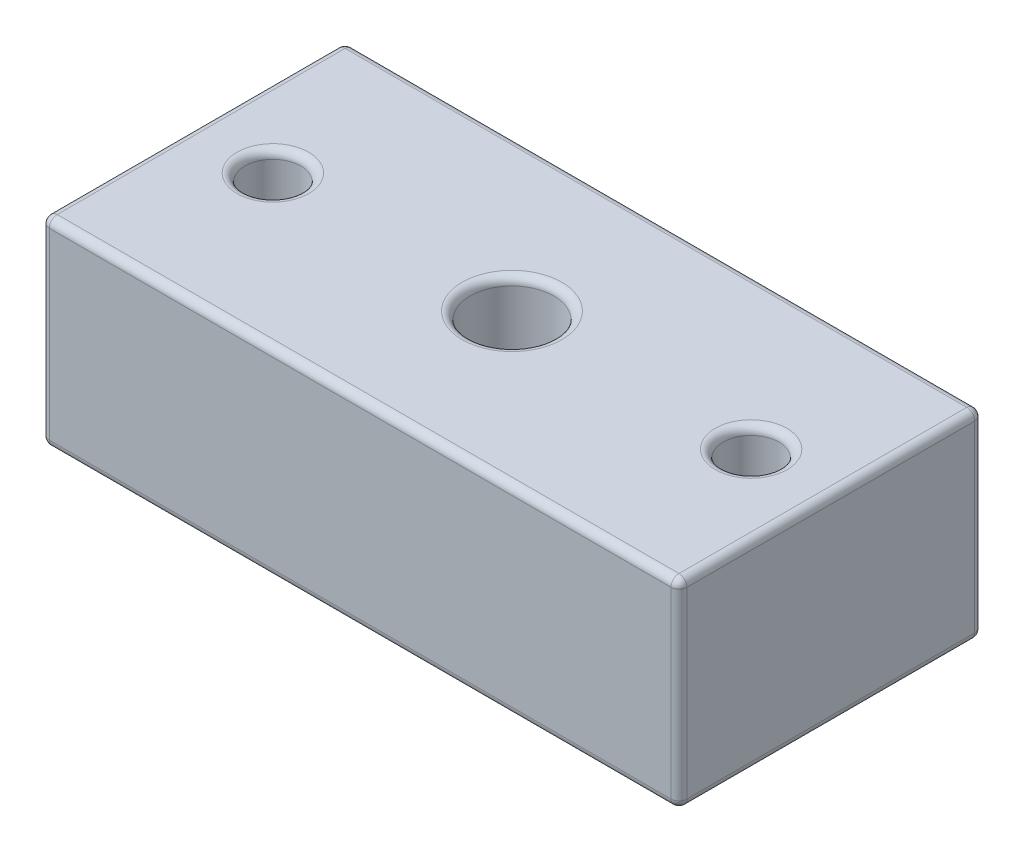
ISO-10303-21;
HEADER;
FILE_DESCRIPTION(('STEP AP214'),'2;1');
FILE_NAME('part.step','',(''),(''),'','','');
FILE_SCHEMA(('AUTOMOTIVE_DESIGN { 1 0 10303 214 1 1 1 1 }'));
ENDSEC;
DATA;
#1=APPLICATION_CONTEXT('core data for automotive mechanical design processes');
#2=APPLICATION_PROTOCOL_DEFINITION('international standard','automotive_design',2000,#1);
#3=PRODUCT_CONTEXT('',#1,'mechanical');
#4=PRODUCT('Part','Part','',(#3));
#5=PRODUCT_RELATED_PRODUCT_CATEGORY('part','',(#4));
#6=PRODUCT_DEFINITION_FORMATION('','',#4);
#7=PRODUCT_DEFINITION_CONTEXT('part definition',#1,'design');
#8=PRODUCT_DEFINITION('design','',#6,#7);
#9=PRODUCT_DEFINITION_SHAPE('','',#8);
#10=(LENGTH_UNIT() NAMED_UNIT(*) SI_UNIT(.MILLI.,.METRE.));
#11=(NAMED_UNIT(*) PLANE_ANGLE_UNIT() SI_UNIT($,.RADIAN.));
#12=(NAMED_UNIT(*) SI_UNIT($,.STERADIAN.) SOLID_ANGLE_UNIT());
#13=UNCERTAINTY_MEASURE_WITH_UNIT(LENGTH_MEASURE(1.E-05),#10,'distance_accuracy_value','');
#14=(GEOMETRIC_REPRESENTATION_CONTEXT(3) GLOBAL_UNCERTAINTY_ASSIGNED_CONTEXT((#13)) GLOBAL_UNIT_ASSIGNED_CONTEXT((#10,
#11,#12)) REPRESENTATION_CONTEXT('',''));
#15=CARTESIAN_POINT('',(0.,0.,0.));
#16=DIRECTION('',(0.,0.,1.));
#17=DIRECTION('',(1.,0.,0.));
#18=AXIS2_PLACEMENT_3D('',#15,#16,#17);
#19=CARTESIAN_POINT('',(0.,20.,0.));
#20=DIRECTION('',(0.,0.,-1.));
#21=DIRECTION('',(-1.,0.,0.));
#22=AXIS2_PLACEMENT_3D('',#19,#20,#21);
#23=PLANE('',#22);
#24=DIRECTION('',(1.,0.,0.));
#25=VECTOR('',#24,1.);
#26=CARTESIAN_POINT('',(0.,-4.,0.));
#27=LINE('',#26,#25);
#28=CARTESIAN_POINT('',(79.,-4.,0.));
#29=VERTEX_POINT('',#28);
#30=CARTESIAN_POINT('',(1.,-4.,0.));
#31=VERTEX_POINT('',#30);
#32=EDGE_CURVE('E268',#29,#31,#27,.F.);
#33=ORIENTED_EDGE('',*,*,#32,.T.);
#34=DIRECTION('',(0.,-1.,0.));
#35=VECTOR('',#34,1.);
#36=CARTESIAN_POINT('',(1.,20.,0.));
#37=LINE('',#36,#35);
#38=CARTESIAN_POINT('',(1.,19.,0.));
#39=VERTEX_POINT('',#38);
#40=EDGE_CURVE('E270',#31,#39,#37,.F.);
#41=ORIENTED_EDGE('',*,*,#40,.T.);
#42=DIRECTION('',(1.,0.,0.));
#43=VECTOR('',#42,1.);
#44=CARTESIAN_POINT('',(0.,19.,0.));
#45=LINE('',#44,#43);
#46=CARTESIAN_POINT('',(79.,19.,0.));
#47=VERTEX_POINT('',#46);
#48=EDGE_CURVE('E264',#39,#47,#45,.T.);
#49=ORIENTED_EDGE('',*,*,#48,.T.);
#50=DIRECTION('',(0.,-1.,0.));
#51=VECTOR('',#50,1.);
#52=CARTESIAN_POINT('',(79.,20.,0.));
#53=LINE('',#52,#51);
#54=EDGE_CURVE('E266',#47,#29,#53,.T.);
#55=ORIENTED_EDGE('',*,*,#54,.T.);
#56=EDGE_LOOP('',(#33,#41,#49,#55));
#57=FACE_BOUND('',#56,.T.);
#58=DIRECTION('',(0.,1.,0.));
#59=VECTOR('',#58,1.);
#60=CARTESIAN_POINT('',(36.4999999999999,0.,0.));
#61=LINE('',#60,#59);
#62=CARTESIAN_POINT('',(36.4999999999999,2.,0.));
#63=VERTEX_POINT('',#62);
#64=CARTESIAN_POINT('',(36.4999999999999,5.5,0.));
#65=VERTEX_POINT('',#64);
#66=EDGE_CURVE('E67',#63,#65,#61,.T.);
#67=ORIENTED_EDGE('',*,*,#66,.F.);
#68=CARTESIAN_POINT('',(39.9999999999999,2.,0.));
#69=DIRECTION('',(0.,0.,1.));
#70=DIRECTION('',(1.,0.,0.));
#71=AXIS2_PLACEMENT_3D('',#68,#69,#70);
#72=CIRCLE('',#71,3.5);
#73=CARTESIAN_POINT('',(43.4999999999999,2.,0.));
#74=VERTEX_POINT('',#73);
#75=EDGE_CURVE('E167',#63,#74,#72,.T.);
#76=ORIENTED_EDGE('',*,*,#75,.T.);
#77=DIRECTION('',(0.,1.,0.));
#78=VECTOR('',#77,1.);
#79=CARTESIAN_POINT('',(43.4999999999999,0.,0.));
#80=LINE('',#79,#78);
#81=CARTESIAN_POINT('',(43.4999999999999,5.5,0.));
#82=VERTEX_POINT('',#81);
#83=EDGE_CURVE('E173',#74,#82,#80,.T.);
#84=ORIENTED_EDGE('',*,*,#83,.T.);
#85=CARTESIAN_POINT('',(39.9999999999999,5.5,0.));
#86=DIRECTION('',(0.,0.,1.));
#87=DIRECTION('',(1.,0.,0.));
#88=AXIS2_PLACEMENT_3D('',#85,#86,#87);
#89=CIRCLE('',#88,3.5);
#90=EDGE_CURVE('E176',#82,#65,#89,.T.);
#91=ORIENTED_EDGE('',*,*,#90,.T.);
#92=EDGE_LOOP('',(#67,#76,#84,#91));
#93=FACE_BOUND('',#92,.T.);
#94=ADVANCED_FACE('F42',(#57,#93),#23,.T.);
#95=CARTESIAN_POINT('',(40.,20.,19.05));
#96=DIRECTION('',(0.,-1.,0.));
#97=DIRECTION('',(0.,0.,-1.));
#98=AXIS2_PLACEMENT_3D('',#95,#96,#97);
#99=CYLINDRICAL_SURFACE('',#98,10.5);
#100=DIRECTION('',(0.,-1.,0.));
#101=VECTOR('',#100,1.);
#102=CARTESIAN_POINT('',(36.4999999999999,20.,9.15050506338836));
#103=LINE('',#102,#101);
#104=CARTESIAN_POINT('',(36.4999999999999,5.5,9.15050506338836));
#105=VERTEX_POINT('',#104);
#106=CARTESIAN_POINT('',(36.4999999999999,2.,9.15050506338836));
#107=VERTEX_POINT('',#106);
#108=EDGE_CURVE('E160',#105,#107,#103,.T.);
#109=ORIENTED_EDGE('',*,*,#108,.F.);
#110=CARTESIAN_POINT('',(36.4999999999999,5.5,9.15050506338836));
#111=CARTESIAN_POINT('',(36.4999874124542,5.59548990894847,9.15052029417582));
#112=CARTESIAN_POINT('',(36.5039075788977,5.69097130454556,9.14912378533606));
#113=CARTESIAN_POINT('',(36.5195153590734,5.88119345368895,9.14362066230592));
#114=CARTESIAN_POINT('',(36.5312008760391,5.97593440018324,9.13951477969103));
#115=CARTESIAN_POINT('',(36.5621955680808,6.16372668369639,9.12872212646493));
#116=CARTESIAN_POINT('',(36.581482131316,6.2567821835713,9.12204301209836));
#117=CARTESIAN_POINT('',(36.6274814655783,6.44081157601583,9.106323321316));
#118=CARTESIAN_POINT('',(36.6541945049956,6.53178539322553,9.09728265955543));
#119=CARTESIAN_POINT('',(36.7451182817129,6.80054621160108,9.06702082888518));
#120=CARTESIAN_POINT('',(36.8201601646548,6.97445082046148,9.04264258562288));
#121=CARTESIAN_POINT('',(36.996751022514,7.30722753604522,8.98824152277516));
#122=CARTESIAN_POINT('',(37.0983162742467,7.46609033007884,8.95821524028655));
#123=CARTESIAN_POINT('',(37.329318058138,7.77051006487299,8.89459344654566));
#124=CARTESIAN_POINT('',(37.4596120151437,7.91539919992824,8.86090934800078));
#125=CARTESIAN_POINT('',(37.7425410033573,8.1817239444744,8.79451522584178));
#126=CARTESIAN_POINT('',(37.8951800043006,8.30315537764939,8.7618053765543));
#127=CARTESIAN_POINT('',(38.2233870849901,8.52217751416979,8.70001411462704));
#128=CARTESIAN_POINT('',(38.3994496456615,8.61906323160353,8.67104969044832));
#129=CARTESIAN_POINT('',(38.7664976666904,8.78157309464441,8.62106369372534));
#130=CARTESIAN_POINT('',(38.9574785476129,8.84720679004201,8.60003969520388));
#131=CARTESIAN_POINT('',(39.3418972790609,8.94307498951626,8.56893251099217));
#132=CARTESIAN_POINT('',(39.5350185718738,8.97446144945536,8.55849418454639));
#133=CARTESIAN_POINT('',(39.9240536144191,9.00460704932108,8.54847370671976));
#134=CARTESIAN_POINT('',(40.1199666876509,9.00337396358892,8.54888896856138));
#135=CARTESIAN_POINT('',(40.5008634409032,8.96904504165395,8.5602886435316));
#136=CARTESIAN_POINT('',(40.6859743972057,8.93720089883591,8.57085784948926));
#137=CARTESIAN_POINT('',(41.0480542873053,8.84462367293924,8.60085639828856));
#138=CARTESIAN_POINT('',(41.225022769036,8.783888987989,8.62028623241614));
#139=CARTESIAN_POINT('',(41.5685339471996,8.63452570718841,8.66635155069108));
#140=CARTESIAN_POINT('',(41.7349088936425,8.54554072321962,8.69307845106875));
#141=CARTESIAN_POINT('',(42.0507369382261,8.34248828847253,8.7509566558499));
#142=CARTESIAN_POINT('',(42.2001854164827,8.22841401473579,8.78210916296653));
#143=CARTESIAN_POINT('',(42.4853372627124,7.9721586818386,8.84727960369721));
#144=CARTESIAN_POINT('',(42.6200645741856,7.82890865348844,8.88136339668392));
#145=CARTESIAN_POINT('',(42.8639651575442,7.52142672082241,8.94734118404954));
#146=CARTESIAN_POINT('',(42.9731301737788,7.35718806437531,8.97923446863376));
#147=CARTESIAN_POINT('',(43.1159603802706,7.09712616841994,9.02287102976814));
#148=CARTESIAN_POINT('',(43.1603456359108,7.00740152082846,9.0368075674704));
#149=CARTESIAN_POINT('',(43.2413508366848,6.82425564166324,9.06273538092494));
#150=CARTESIAN_POINT('',(43.2779740143183,6.73083596818386,9.07472746594932));
#151=CARTESIAN_POINT('',(43.3430899854761,6.54106004925434,9.09636108594429));
#152=CARTESIAN_POINT('',(43.3715916242007,6.44470712603395,9.10600517644492));
#153=CARTESIAN_POINT('',(43.4202336139019,6.24972786485855,9.12263075512183));
#154=CARTESIAN_POINT('',(43.4403777828797,6.1511025867834,9.1296134589991));
#155=CARTESIAN_POINT('',(43.4707921758105,5.96056285926808,9.14021434188641));
#156=CARTESIAN_POINT('',(43.4817420324845,5.86876917036872,9.1440632904518));
#157=CARTESIAN_POINT('',(43.4963468308114,5.68465270888764,9.14921371091957));
#158=CARTESIAN_POINT('',(43.5000111856703,5.5923307737906,9.15051846999064));
#159=CARTESIAN_POINT('',(43.4999999999999,5.5,9.15050506338831));
#160=B_SPLINE_CURVE_WITH_KNOTS('',3,(#110,#111,#112,#113,#114,#115,#116,#117,#118,#119,#120,
#121,#122,#123,#124,#125,#126,#127,#128,#129,#130,#131,#132,#133,#134,#135,#136,#137,#138,#139,
#140,#141,#142,#143,#144,#145,#146,#147,#148,#149,#150,#151,#152,#153,#154,#155,#156,#157,#158,
#159),.UNSPECIFIED.,.F.,.F.,(4,2,2,2,2,2,2,2,2,2,2,2,2,2,2,2,2,2,2,2,2,2,2,2,4),(0.,
0.286364696574014,0.572652101593116,0.858094201200702,1.14354661792754,1.71361423692556,
2.28403251951732,2.87459009723745,3.46525271877489,4.07133207620227,4.67722611278318,
5.26204389900284,5.84672230461622,6.40846706984447,6.97024298533241,7.53940808245261,
8.10872815415064,8.70480431557549,9.30107272226721,9.60395972919264,9.90672035058273,
10.2091499627614,10.5114412613721,10.788694735979,11.0655897528497),.UNSPECIFIED.);
#161=CARTESIAN_POINT('',(43.4999999999999,5.5,9.15050506338831));
#162=VERTEX_POINT('',#161);
#163=EDGE_CURVE('E163',#105,#162,#160,.T.);
#164=ORIENTED_EDGE('',*,*,#163,.T.);
#165=DIRECTION('',(0.,-1.,0.));
#166=VECTOR('',#165,1.);
#167=CARTESIAN_POINT('',(43.4999999999999,20.,9.15050506338831));
#168=LINE('',#167,#166);
#169=CARTESIAN_POINT('',(43.4999999999999,2.,9.15050506338831));
#170=VERTEX_POINT('',#169);
#171=EDGE_CURVE('E193',#162,#170,#168,.T.);
#172=ORIENTED_EDGE('',*,*,#171,.T.);
#173=CARTESIAN_POINT('',(43.4999999999999,2.,9.15050506338831));
#174=CARTESIAN_POINT('',(43.5000125875456,1.90451009105153,9.15052029417577));
#175=CARTESIAN_POINT('',(43.4960924211021,1.80902869545444,9.14912378533601));
#176=CARTESIAN_POINT('',(43.4804846409265,1.61880654631105,9.14362066230587));
#177=CARTESIAN_POINT('',(43.4687991239607,1.52406559981675,9.13951477969098));
#178=CARTESIAN_POINT('',(43.4378044319191,1.3362733163036,9.12872212646488));
#179=CARTESIAN_POINT('',(43.4185178686839,1.24321781642869,9.12204301209831));
#180=CARTESIAN_POINT('',(43.3725185344216,1.05918842398416,9.10632332131595));
#181=CARTESIAN_POINT('',(43.3458054950042,0.968214606774458,9.09728265955538));
#182=CARTESIAN_POINT('',(43.254881718287,0.699453788398908,9.06702082888513));
#183=CARTESIAN_POINT('',(43.1798398353451,0.525549179538514,9.04264258562284));
#184=CARTESIAN_POINT('',(43.0032489774859,0.192772463954766,8.98824152277512));
#185=CARTESIAN_POINT('',(42.9016837257531,0.0339096699211489,8.95821524028651));
#186=CARTESIAN_POINT('',(42.6706819418619,-0.270510064873003,8.89459344654562));
#187=CARTESIAN_POINT('',(42.5403879848562,-0.415399199928248,8.86090934800075));
#188=CARTESIAN_POINT('',(42.2574589966425,-0.681723944474409,8.79451522584176));
#189=CARTESIAN_POINT('',(42.1048199956993,-0.803155377649398,8.76180537655427));
#190=CARTESIAN_POINT('',(41.7766129150098,-1.0221775141698,8.70001411462701));
#191=CARTESIAN_POINT('',(41.6005503543384,-1.11906323160354,8.6710496904483));
#192=CARTESIAN_POINT('',(41.2335023333094,-1.28157309464442,8.62106369372532));
#193=CARTESIAN_POINT('',(41.042521452387,-1.34720679004201,8.60003969520386));
#194=CARTESIAN_POINT('',(40.6581027209389,-1.44307498951627,8.56893251099216));
#195=CARTESIAN_POINT('',(40.4649814281261,-1.47446144945536,8.55849418454638));
#196=CARTESIAN_POINT('',(40.0759463855808,-1.50460704932108,8.54847370671976));
#197=CARTESIAN_POINT('',(39.880033312349,-1.50337396358893,8.54888896856138));
#198=CARTESIAN_POINT('',(39.4991365590966,-1.46904504165396,8.5602886435316));
#199=CARTESIAN_POINT('',(39.3140256027941,-1.43720089883592,8.57085784948927));
#200=CARTESIAN_POINT('',(38.9519457126946,-1.34462367293924,8.60085639828857));
#201=CARTESIAN_POINT('',(38.7749772309639,-1.283888987989,8.62028623241616));
#202=CARTESIAN_POINT('',(38.4314660528002,-1.13452570718842,8.6663515506911));
#203=CARTESIAN_POINT('',(38.2650911063574,-1.04554072321963,8.69307845106877));
#204=CARTESIAN_POINT('',(37.9492630617737,-0.842488288472529,8.75095665584993));
#205=CARTESIAN_POINT('',(37.7998145835172,-0.728414014735793,8.78210916296656));
#206=CARTESIAN_POINT('',(37.5146627372874,-0.472158681838606,8.84727960369724));
#207=CARTESIAN_POINT('',(37.3799354258142,-0.328908653488437,8.88136339668395));
#208=CARTESIAN_POINT('',(37.1360348424557,-0.0214267208224094,8.94734118404958));
#209=CARTESIAN_POINT('',(37.0268698262211,0.142811935624699,8.9792344686338));
#210=CARTESIAN_POINT('',(36.8840396197293,0.402873831580067,9.02287102976819));
#211=CARTESIAN_POINT('',(36.839654364089,0.492598479171546,9.03680756747044));
#212=CARTESIAN_POINT('',(36.7586491633151,0.67574435833677,9.06273538092498));
#213=CARTESIAN_POINT('',(36.7220259856815,0.769164031816147,9.07472746594937));
#214=CARTESIAN_POINT('',(36.6569100145237,0.958939950745666,9.09636108594434));
#215=CARTESIAN_POINT('',(36.6284083757992,1.05529287396606,9.10600517644496));
#216=CARTESIAN_POINT('',(36.579766386098,1.25027213514145,9.12263075512188));
#217=CARTESIAN_POINT('',(36.5596222171202,1.34889741321661,9.12961345899915));
#218=CARTESIAN_POINT('',(36.5292078241893,1.53943714073192,9.14021434188646));
#219=CARTESIAN_POINT('',(36.5182579675154,1.63123082963129,9.14406329045185));
#220=CARTESIAN_POINT('',(36.5036531691885,1.81534729111236,9.14921371091962));
#221=CARTESIAN_POINT('',(36.4999888143295,1.90766922620939,9.15051846999069));
#222=CARTESIAN_POINT('',(36.4999999999999,2.,9.15050506338836));
#223=B_SPLINE_CURVE_WITH_KNOTS('',3,(#173,#174,#175,#176,#177,#178,#179,#180,#181,#182,#183,
#184,#185,#186,#187,#188,#189,#190,#191,#192,#193,#194,#195,#196,#197,#198,#199,#200,#201,#202,
#203,#204,#205,#206,#207,#208,#209,#210,#211,#212,#213,#214,#215,#216,#217,#218,#219,#220,#221,
#222),.UNSPECIFIED.,.F.,.F.,(4,2,2,2,2,2,2,2,2,2,2,2,2,2,2,2,2,2,2,2,2,2,2,2,4),(0.,
0.286364696574015,0.572652101593118,0.858094201200704,1.14354661792755,1.71361423692557,
2.28403251951733,2.87459009723746,3.4652527187749,4.07133207620228,4.67722611278319,
5.26204389900284,5.84672230461622,6.40846706984446,6.97024298533241,7.53940808245261,
8.10872815415064,8.7048043155755,9.30107272226722,9.60395972919265,9.90672035058275,
10.2091499627614,10.5114412613721,10.788694735979,11.0655897528497),.UNSPECIFIED.);
#224=EDGE_CURVE('E211',#170,#107,#223,.T.);
#225=ORIENTED_EDGE('',*,*,#224,.T.);
#226=EDGE_LOOP('',(#109,#164,#172,#225));
#227=FACE_BOUND('',#226,.T.);
#228=CARTESIAN_POINT('',(40.,-4.,19.05));
#229=DIRECTION('',(0.,1.,0.));
#230=DIRECTION('',(0.,0.,1.));
#231=AXIS2_PLACEMENT_3D('',#228,#229,#230);
#232=CIRCLE('',#231,10.5);
#233=CARTESIAN_POINT('',(40.,-4.,29.55));
#234=VERTEX_POINT('',#233);
#235=EDGE_CURVE('E243',#234,#234,#232,.F.);
#236=ORIENTED_EDGE('',*,*,#235,.T.);
#237=EDGE_LOOP('',(#236));
#238=FACE_BOUND('',#237,.T.);
#239=CARTESIAN_POINT('',(40.,10.,19.05));
#240=DIRECTION('',(0.,1.,0.));
#241=DIRECTION('',(0.,0.,1.));
#242=AXIS2_PLACEMENT_3D('',#239,#240,#241);
#243=CIRCLE('',#242,10.5);
#244=CARTESIAN_POINT('',(40.,10.,29.55));
#245=VERTEX_POINT('',#244);
#246=EDGE_CURVE('E228',#245,#245,#243,.T.);
#247=ORIENTED_EDGE('',*,*,#246,.T.);
#248=EDGE_LOOP('',(#247));
#249=FACE_BOUND('',#248,.T.);
#250=ADVANCED_FACE('F195',(#227,#238,#249),#99,.F.);
#251=CARTESIAN_POINT('',(80.,20.,0.));
#252=DIRECTION('',(1.,0.,0.));
#253=DIRECTION('',(0.,0.,-1.));
#254=AXIS2_PLACEMENT_3D('',#251,#252,#253);
#255=PLANE('',#254);
#256=DIRECTION('',(0.,0.,1.));
#257=VECTOR('',#256,1.);
#258=CARTESIAN_POINT('',(80.,-4.,0.));
#259=LINE('',#258,#257);
#260=CARTESIAN_POINT('',(80.,-4.,37.1));
#261=VERTEX_POINT('',#260);
#262=CARTESIAN_POINT('',(80.,-4.,1.));
#263=VERTEX_POINT('',#262);
#264=EDGE_CURVE('E277',#261,#263,#259,.F.);
#265=ORIENTED_EDGE('',*,*,#264,.T.);
#266=DIRECTION('',(0.,-1.,0.));
#267=VECTOR('',#266,1.);
#268=CARTESIAN_POINT('',(80.,20.,1.));
#269=LINE('',#268,#267);
#270=CARTESIAN_POINT('',(80.,19.,1.));
#271=VERTEX_POINT('',#270);
#272=EDGE_CURVE('E279',#263,#271,#269,.F.);
#273=ORIENTED_EDGE('',*,*,#272,.T.);
#274=DIRECTION('',(0.,0.,1.));
#275=VECTOR('',#274,1.);
#276=CARTESIAN_POINT('',(80.,19.,0.));
#277=LINE('',#276,#275);
#278=CARTESIAN_POINT('',(80.,19.,37.1));
#279=VERTEX_POINT('',#278);
#280=EDGE_CURVE('E273',#271,#279,#277,.T.);
#281=ORIENTED_EDGE('',*,*,#280,.T.);
#282=DIRECTION('',(0.,-1.,0.));
#283=VECTOR('',#282,1.);
#284=CARTESIAN_POINT('',(80.,-5.,37.1));
#285=LINE('',#284,#283);
#286=EDGE_CURVE('E275',#279,#261,#285,.T.);
#287=ORIENTED_EDGE('',*,*,#286,.T.);
#288=EDGE_LOOP('',(#265,#273,#281,#287));
#289=FACE_BOUND('',#288,.T.);
#290=ADVANCED_FACE('F437',(#289),#255,.T.);
#291=CARTESIAN_POINT('',(0.,20.,0.));
#292=DIRECTION('',(1.,0.,0.));
#293=DIRECTION('',(0.,0.,-1.));
#294=AXIS2_PLACEMENT_3D('',#291,#292,#293);
#295=PLANE('',#294);
#296=DIRECTION('',(0.,0.,1.));
#297=VECTOR('',#296,1.);
#298=CARTESIAN_POINT('',(0.,-4.,0.));
#299=LINE('',#298,#297);
#300=CARTESIAN_POINT('',(0.,-4.,1.));
#301=VERTEX_POINT('',#300);
#302=CARTESIAN_POINT('',(0.,-4.,37.1));
#303=VERTEX_POINT('',#302);
#304=EDGE_CURVE('E259',#301,#303,#299,.T.);
#305=ORIENTED_EDGE('',*,*,#304,.T.);
#306=DIRECTION('',(0.,-1.,0.));
#307=VECTOR('',#306,1.);
#308=CARTESIAN_POINT('',(0.,20.,37.1));
#309=LINE('',#308,#307);
#310=CARTESIAN_POINT('',(0.,19.,37.1));
#311=VERTEX_POINT('',#310);
#312=EDGE_CURVE('E261',#303,#311,#309,.F.);
#313=ORIENTED_EDGE('',*,*,#312,.T.);
#314=DIRECTION('',(0.,0.,1.));
#315=VECTOR('',#314,1.);
#316=CARTESIAN_POINT('',(0.,19.,0.));
#317=LINE('',#316,#315);
#318=CARTESIAN_POINT('',(0.,19.,1.));
#319=VERTEX_POINT('',#318);
#320=EDGE_CURVE('E255',#311,#319,#317,.F.);
#321=ORIENTED_EDGE('',*,*,#320,.T.);
#322=DIRECTION('',(0.,-1.,0.));
#323=VECTOR('',#322,1.);
#324=CARTESIAN_POINT('',(0.,-5.,1.));
#325=LINE('',#324,#323);
#326=EDGE_CURVE('E257',#319,#301,#325,.T.);
#327=ORIENTED_EDGE('',*,*,#326,.T.);
#328=EDGE_LOOP('',(#305,#313,#321,#327));
#329=FACE_BOUND('',#328,.T.);
#330=ADVANCED_FACE('F404',(#329),#295,.F.);
#331=CARTESIAN_POINT('',(10.,20.,19.05));
#332=DIRECTION('',(0.,-1.,0.));
#333=DIRECTION('',(0.,0.,-1.));
#334=AXIS2_PLACEMENT_3D('',#331,#332,#333);
#335=CYLINDRICAL_SURFACE('',#334,3.5);
#336=CARTESIAN_POINT('',(10.,19.,19.05));
#337=DIRECTION('',(0.,1.,0.));
#338=DIRECTION('',(0.,0.,1.));
#339=AXIS2_PLACEMENT_3D('',#336,#337,#338);
#340=CIRCLE('',#339,3.5);
#341=CARTESIAN_POINT('',(10.,19.,22.55));
#342=VERTEX_POINT('',#341);
#343=EDGE_CURVE('E12',#342,#342,#340,.T.);
#344=ORIENTED_EDGE('',*,*,#343,.T.);
#345=EDGE_LOOP('',(#344));
#346=FACE_BOUND('',#345,.T.);
#347=CARTESIAN_POINT('',(10.,-5.,19.05));
#348=DIRECTION('',(0.,1.,0.));
#349=DIRECTION('',(0.,0.,1.));
#350=AXIS2_PLACEMENT_3D('',#347,#348,#349);
#351=CIRCLE('',#350,3.5);
#352=CARTESIAN_POINT('',(10.,-5.,22.55));
#353=VERTEX_POINT('',#352);
#354=EDGE_CURVE('E219',#353,#353,#351,.T.);
#355=ORIENTED_EDGE('',*,*,#354,.F.);
#356=EDGE_LOOP('',(#355));
#357=FACE_BOUND('',#356,.T.);
#358=ADVANCED_FACE('F484',(#346,#357),#335,.F.);
#359=CARTESIAN_POINT('',(0.,20.,38.1));
#360=DIRECTION('',(0.,0.,-1.));
#361=DIRECTION('',(-1.,0.,0.));
#362=AXIS2_PLACEMENT_3D('',#359,#360,#361);
#363=PLANE('',#362);
#364=DIRECTION('',(0.,-1.,0.));
#365=VECTOR('',#364,1.);
#366=CARTESIAN_POINT('',(1.00000000000001,20.,38.1));
#367=LINE('',#366,#365);
#368=CARTESIAN_POINT('',(1.00000000000001,19.,38.1));
#369=VERTEX_POINT('',#368);
#370=CARTESIAN_POINT('',(1.00000000000001,-4.,38.1));
#371=VERTEX_POINT('',#370);
#372=EDGE_CURVE('E250',#369,#371,#367,.T.);
#373=ORIENTED_EDGE('',*,*,#372,.T.);
#374=DIRECTION('',(1.,0.,0.));
#375=VECTOR('',#374,1.);
#376=CARTESIAN_POINT('',(0.,-4.,38.1));
#377=LINE('',#376,#375);
#378=CARTESIAN_POINT('',(79.,-4.,38.1));
#379=VERTEX_POINT('',#378);
#380=EDGE_CURVE('E252',#371,#379,#377,.T.);
#381=ORIENTED_EDGE('',*,*,#380,.T.);
#382=DIRECTION('',(0.,-1.,0.));
#383=VECTOR('',#382,1.);
#384=CARTESIAN_POINT('',(79.,20.,38.1));
#385=LINE('',#384,#383);
#386=CARTESIAN_POINT('',(79.,19.,38.1));
#387=VERTEX_POINT('',#386);
#388=EDGE_CURVE('E248',#379,#387,#385,.F.);
#389=ORIENTED_EDGE('',*,*,#388,.T.);
#390=DIRECTION('',(1.,0.,0.));
#391=VECTOR('',#390,1.);
#392=CARTESIAN_POINT('',(0.,19.,38.1));
#393=LINE('',#392,#391);
#394=EDGE_CURVE('E246',#387,#369,#393,.F.);
#395=ORIENTED_EDGE('',*,*,#394,.T.);
#396=EDGE_LOOP('',(#373,#381,#389,#395));
#397=FACE_BOUND('',#396,.T.);
#398=ADVANCED_FACE('F488',(#397),#363,.F.);
#399=CARTESIAN_POINT('',(70.,20.,19.05));
#400=DIRECTION('',(0.,-1.,0.));
#401=DIRECTION('',(0.,0.,-1.));
#402=AXIS2_PLACEMENT_3D('',#399,#400,#401);
#403=CYLINDRICAL_SURFACE('',#402,3.50000000000001);
#404=CARTESIAN_POINT('',(70.,19.,19.05));
#405=DIRECTION('',(0.,1.,0.));
#406=DIRECTION('',(0.,0.,1.));
#407=AXIS2_PLACEMENT_3D('',#404,#405,#406);
#408=CIRCLE('',#407,3.50000000000001);
#409=CARTESIAN_POINT('',(70.,19.,22.55));
#410=VERTEX_POINT('',#409);
#411=EDGE_CURVE('E51',#410,#410,#408,.T.);
#412=ORIENTED_EDGE('',*,*,#411,.T.);
#413=EDGE_LOOP('',(#412));
#414=FACE_BOUND('',#413,.T.);
#415=CARTESIAN_POINT('',(70.,-5.,19.05));
#416=DIRECTION('',(0.,1.,0.));
#417=DIRECTION('',(0.,0.,1.));
#418=AXIS2_PLACEMENT_3D('',#415,#416,#417);
#419=CIRCLE('',#418,3.50000000000001);
#420=CARTESIAN_POINT('',(70.,-5.,22.55));
#421=VERTEX_POINT('',#420);
#422=EDGE_CURVE('E222',#421,#421,#419,.T.);
#423=ORIENTED_EDGE('',*,*,#422,.F.);
#424=EDGE_LOOP('',(#423));
#425=FACE_BOUND('',#424,.T.);
#426=ADVANCED_FACE('F494',(#414,#425),#403,.F.);
#427=CARTESIAN_POINT('',(0.,20.,0.));
#428=DIRECTION('',(0.,1.,0.));
#429=DIRECTION('',(0.,0.,1.));
#430=AXIS2_PLACEMENT_3D('',#427,#428,#429);
#431=PLANE('',#430);
#432=CARTESIAN_POINT('',(40.,20.,19.05));
#433=DIRECTION('',(0.,1.,0.));
#434=DIRECTION('',(0.,0.,1.));
#435=AXIS2_PLACEMENT_3D('',#432,#433,#434);
#436=CIRCLE('',#435,6.25);
#437=CARTESIAN_POINT('',(40.,20.,25.3));
#438=VERTEX_POINT('',#437);
#439=EDGE_CURVE('E300',#438,#438,#436,.F.);
#440=ORIENTED_EDGE('',*,*,#439,.T.);
#441=EDGE_LOOP('',(#440));
#442=FACE_BOUND('',#441,.T.);
#443=CARTESIAN_POINT('',(70.,20.,19.05));
#444=DIRECTION('',(0.,1.,0.));
#445=DIRECTION('',(0.,0.,1.));
#446=AXIS2_PLACEMENT_3D('',#443,#444,#445);
#447=CIRCLE('',#446,4.50000000000001);
#448=CARTESIAN_POINT('',(70.,20.,23.55));
#449=VERTEX_POINT('',#448);
#450=EDGE_CURVE('E297',#449,#449,#447,.F.);
#451=ORIENTED_EDGE('',*,*,#450,.T.);
#452=EDGE_LOOP('',(#451));
#453=FACE_BOUND('',#452,.T.);
#454=CARTESIAN_POINT('',(10.,20.,19.05));
#455=DIRECTION('',(0.,1.,0.));
#456=DIRECTION('',(0.,0.,1.));
#457=AXIS2_PLACEMENT_3D('',#454,#455,#456);
#458=CIRCLE('',#457,4.5);
#459=CARTESIAN_POINT('',(10.,20.,23.55));
#460=VERTEX_POINT('',#459);
#461=EDGE_CURVE('E294',#460,#460,#458,.F.);
#462=ORIENTED_EDGE('',*,*,#461,.T.);
#463=EDGE_LOOP('',(#462));
#464=FACE_BOUND('',#463,.T.);
#465=DIRECTION('',(0.,0.,1.));
#466=VECTOR('',#465,1.);
#467=CARTESIAN_POINT('',(1.00000000000001,20.,38.1));
#468=LINE('',#467,#466);
#469=CARTESIAN_POINT('',(1.,20.,1.));
#470=VERTEX_POINT('',#469);
#471=CARTESIAN_POINT('',(1.00000000000001,20.,37.1));
#472=VERTEX_POINT('',#471);
#473=EDGE_CURVE('E289',#470,#472,#468,.T.);
#474=ORIENTED_EDGE('',*,*,#473,.T.);
#475=DIRECTION('',(1.,0.,0.));
#476=VECTOR('',#475,1.);
#477=CARTESIAN_POINT('',(80.,20.,37.1));
#478=LINE('',#477,#476);
#479=CARTESIAN_POINT('',(79.,20.,37.1));
#480=VERTEX_POINT('',#479);
#481=EDGE_CURVE('E291',#472,#480,#478,.T.);
#482=ORIENTED_EDGE('',*,*,#481,.T.);
#483=DIRECTION('',(0.,0.,1.));
#484=VECTOR('',#483,1.);
#485=CARTESIAN_POINT('',(79.,20.,0.));
#486=LINE('',#485,#484);
#487=CARTESIAN_POINT('',(79.,20.,1.));
#488=VERTEX_POINT('',#487);
#489=EDGE_CURVE('E285',#480,#488,#486,.F.);
#490=ORIENTED_EDGE('',*,*,#489,.T.);
#491=DIRECTION('',(1.,0.,0.));
#492=VECTOR('',#491,1.);
#493=CARTESIAN_POINT('',(0.,20.,1.));
#494=LINE('',#493,#492);
#495=EDGE_CURVE('E287',#488,#470,#494,.F.);
#496=ORIENTED_EDGE('',*,*,#495,.T.);
#497=EDGE_LOOP('',(#474,#482,#490,#496));
#498=FACE_BOUND('',#497,.T.);
#499=ADVANCED_FACE('F420',(#442,#453,#464,#498),#431,.T.);
#500=CARTESIAN_POINT('',(40.,10.,19.05));
#501=DIRECTION('',(0.,1.,0.));
#502=DIRECTION('',(0.,0.,1.));
#503=AXIS2_PLACEMENT_3D('',#500,#501,#502);
#504=PLANE('',#503);
#505=CARTESIAN_POINT('',(40.,10.,19.05));
#506=DIRECTION('',(0.,1.,0.));
#507=DIRECTION('',(0.,0.,1.));
#508=AXIS2_PLACEMENT_3D('',#505,#506,#507);
#509=CIRCLE('',#508,5.25);
#510=CARTESIAN_POINT('',(40.,10.,24.3));
#511=VERTEX_POINT('',#510);
#512=EDGE_CURVE('E225',#511,#511,#509,.T.);
#513=ORIENTED_EDGE('',*,*,#512,.T.);
#514=EDGE_LOOP('',(#513));
#515=FACE_BOUND('',#514,.T.);
#516=ORIENTED_EDGE('',*,*,#246,.F.);
#517=EDGE_LOOP('',(#516));
#518=FACE_BOUND('',#517,.T.);
#519=ADVANCED_FACE('F503',(#515,#518),#504,.F.);
#520=CARTESIAN_POINT('',(40.,10.,19.05));
#521=DIRECTION('',(0.,1.,0.));
#522=DIRECTION('',(0.,0.,1.));
#523=AXIS2_PLACEMENT_3D('',#520,#521,#522);
#524=CYLINDRICAL_SURFACE('',#523,5.25);
#525=CARTESIAN_POINT('',(40.,19.,19.05));
#526=DIRECTION('',(0.,1.,0.));
#527=DIRECTION('',(0.,0.,1.));
#528=AXIS2_PLACEMENT_3D('',#525,#526,#527);
#529=CIRCLE('',#528,5.25);
#530=CARTESIAN_POINT('',(40.,19.,24.3));
#531=VERTEX_POINT('',#530);
#532=EDGE_CURVE('E282',#531,#531,#529,.T.);
#533=ORIENTED_EDGE('',*,*,#532,.T.);
#534=EDGE_LOOP('',(#533));
#535=FACE_BOUND('',#534,.T.);
#536=ORIENTED_EDGE('',*,*,#512,.F.);
#537=EDGE_LOOP('',(#536));
#538=FACE_BOUND('',#537,.T.);
#539=ADVANCED_FACE('F507',(#535,#538),#524,.F.);
#540=CARTESIAN_POINT('',(0.,-5.,0.));
#541=DIRECTION('',(0.,1.,0.));
#542=DIRECTION('',(0.,0.,1.));
#543=AXIS2_PLACEMENT_3D('',#540,#541,#542);
#544=PLANE('',#543);
#545=CARTESIAN_POINT('',(40.,-5.,19.05));
#546=DIRECTION('',(0.,1.,0.));
#547=DIRECTION('',(0.,0.,1.));
#548=AXIS2_PLACEMENT_3D('',#545,#546,#547);
#549=CIRCLE('',#548,11.5);
#550=CARTESIAN_POINT('',(40.,-5.,30.55));
#551=VERTEX_POINT('',#550);
#552=EDGE_CURVE('E240',#551,#551,#549,.T.);
#553=ORIENTED_EDGE('',*,*,#552,.T.);
#554=EDGE_LOOP('',(#553));
#555=FACE_BOUND('',#554,.T.);
#556=DIRECTION('',(0.,0.,1.));
#557=VECTOR('',#556,1.);
#558=CARTESIAN_POINT('',(79.,-5.,38.1));
#559=LINE('',#558,#557);
#560=CARTESIAN_POINT('',(79.,-5.,1.));
#561=VERTEX_POINT('',#560);
#562=CARTESIAN_POINT('',(79.,-5.,37.1));
#563=VERTEX_POINT('',#562);
#564=EDGE_CURVE('E231',#561,#563,#559,.T.);
#565=ORIENTED_EDGE('',*,*,#564,.T.);
#566=DIRECTION('',(1.,0.,0.));
#567=VECTOR('',#566,1.);
#568=CARTESIAN_POINT('',(0.,-5.,37.1));
#569=LINE('',#568,#567);
#570=CARTESIAN_POINT('',(1.00000000000001,-5.,37.1));
#571=VERTEX_POINT('',#570);
#572=EDGE_CURVE('E237',#563,#571,#569,.F.);
#573=ORIENTED_EDGE('',*,*,#572,.T.);
#574=DIRECTION('',(0.,0.,1.));
#575=VECTOR('',#574,1.);
#576=CARTESIAN_POINT('',(1.,-5.,0.));
#577=LINE('',#576,#575);
#578=CARTESIAN_POINT('',(1.,-5.,1.));
#579=VERTEX_POINT('',#578);
#580=EDGE_CURVE('E235',#571,#579,#577,.F.);
#581=ORIENTED_EDGE('',*,*,#580,.T.);
#582=DIRECTION('',(1.,0.,0.));
#583=VECTOR('',#582,1.);
#584=CARTESIAN_POINT('',(80.,-5.,1.));
#585=LINE('',#584,#583);
#586=EDGE_CURVE('E233',#579,#561,#585,.T.);
#587=ORIENTED_EDGE('',*,*,#586,.T.);
#588=EDGE_LOOP('',(#565,#573,#581,#587));
#589=FACE_BOUND('',#588,.T.);
#590=ORIENTED_EDGE('',*,*,#354,.T.);
#591=EDGE_LOOP('',(#590));
#592=FACE_BOUND('',#591,.T.);
#593=ORIENTED_EDGE('',*,*,#422,.T.);
#594=EDGE_LOOP('',(#593));
#595=FACE_BOUND('',#594,.T.);
#596=ADVANCED_FACE('F457',(#555,#589,#592,#595),#544,.F.);
#597=CARTESIAN_POINT('',(40.,-4.,19.05));
#598=DIRECTION('',(0.,1.,0.));
#599=DIRECTION('',(0.,0.,1.));
#600=AXIS2_PLACEMENT_3D('',#597,#598,#599);
#601=TOROIDAL_SURFACE('',#600,11.5,1.);
#602=ORIENTED_EDGE('',*,*,#235,.F.);
#603=EDGE_LOOP('',(#602));
#604=FACE_BOUND('',#603,.T.);
#605=ORIENTED_EDGE('',*,*,#552,.F.);
#606=EDGE_LOOP('',(#605));
#607=FACE_BOUND('',#606,.T.);
#608=ADVANCED_FACE('F512',(#604,#607),#601,.T.);
#609=CARTESIAN_POINT('',(0.,19.,1.));
#610=DIRECTION('',(1.,0.,0.));
#611=DIRECTION('',(0.,0.,-1.));
#612=AXIS2_PLACEMENT_3D('',#609,#610,#611);
#613=CYLINDRICAL_SURFACE('',#612,1.);
#614=CARTESIAN_POINT('',(1.,19.,1.));
#615=DIRECTION('',(-1.,0.,0.));
#616=DIRECTION('',(0.,0.,1.));
#617=AXIS2_PLACEMENT_3D('',#614,#615,#616);
#618=CIRCLE('',#617,1.);
#619=EDGE_CURVE('E46',#470,#39,#618,.T.);
#620=ORIENTED_EDGE('',*,*,#619,.F.);
#621=ORIENTED_EDGE('',*,*,#495,.F.);
#622=CARTESIAN_POINT('',(79.,19.,1.));
#623=DIRECTION('',(1.,0.,0.));
#624=DIRECTION('',(0.,0.,-1.));
#625=AXIS2_PLACEMENT_3D('',#622,#623,#624);
#626=CIRCLE('',#625,1.);
#627=EDGE_CURVE('E364',#47,#488,#626,.T.);
#628=ORIENTED_EDGE('',*,*,#627,.F.);
#629=ORIENTED_EDGE('',*,*,#48,.F.);
#630=EDGE_LOOP('',(#620,#621,#628,#629));
#631=FACE_BOUND('',#630,.T.);
#632=ADVANCED_FACE('F381',(#631),#613,.T.);
#633=CARTESIAN_POINT('',(1.,19.,1.));
#634=DIRECTION('',(0.,0.,1.));
#635=DIRECTION('',(1.,0.,0.));
#636=AXIS2_PLACEMENT_3D('',#633,#634,#635);
#637=SPHERICAL_SURFACE('',#636,1.);
#638=CARTESIAN_POINT('',(1.,19.,1.));
#639=DIRECTION('',(0.,0.,-1.));
#640=DIRECTION('',(-1.,0.,0.));
#641=AXIS2_PLACEMENT_3D('',#638,#639,#640);
#642=CIRCLE('',#641,1.);
#643=EDGE_CURVE('E360',#470,#319,#642,.F.);
#644=ORIENTED_EDGE('',*,*,#643,.F.);
#645=ORIENTED_EDGE('',*,*,#619,.T.);
#646=CARTESIAN_POINT('',(1.,19.,1.));
#647=DIRECTION('',(0.,1.,0.));
#648=DIRECTION('',(0.,0.,1.));
#649=AXIS2_PLACEMENT_3D('',#646,#647,#648);
#650=CIRCLE('',#649,1.);
#651=EDGE_CURVE('E363',#319,#39,#650,.F.);
#652=ORIENTED_EDGE('',*,*,#651,.F.);
#653=EDGE_LOOP('',(#644,#645,#652));
#654=FACE_BOUND('',#653,.T.);
#655=ADVANCED_FACE('F376',(#654),#637,.T.);
#656=CARTESIAN_POINT('',(79.,19.,1.));
#657=DIRECTION('',(0.,0.,1.));
#658=DIRECTION('',(1.,0.,0.));
#659=AXIS2_PLACEMENT_3D('',#656,#657,#658);
#660=SPHERICAL_SURFACE('',#659,1.);
#661=CARTESIAN_POINT('',(79.,19.,1.));
#662=DIRECTION('',(0.,1.,0.));
#663=DIRECTION('',(0.,0.,1.));
#664=AXIS2_PLACEMENT_3D('',#661,#662,#663);
#665=CIRCLE('',#664,1.);
#666=EDGE_CURVE('E354',#47,#271,#665,.F.);
#667=ORIENTED_EDGE('',*,*,#666,.F.);
#668=ORIENTED_EDGE('',*,*,#627,.T.);
#669=CARTESIAN_POINT('',(79.,19.,1.));
#670=DIRECTION('',(0.,0.,-1.));
#671=DIRECTION('',(-1.,0.,0.));
#672=AXIS2_PLACEMENT_3D('',#669,#670,#671);
#673=CIRCLE('',#672,1.);
#674=EDGE_CURVE('E357',#271,#488,#673,.F.);
#675=ORIENTED_EDGE('',*,*,#674,.F.);
#676=EDGE_LOOP('',(#667,#668,#675));
#677=FACE_BOUND('',#676,.T.);
#678=ADVANCED_FACE('F431',(#677),#660,.T.);
#679=CARTESIAN_POINT('',(1.,20.,1.));
#680=DIRECTION('',(0.,1.,0.));
#681=DIRECTION('',(0.,0.,1.));
#682=AXIS2_PLACEMENT_3D('',#679,#680,#681);
#683=CYLINDRICAL_SURFACE('',#682,1.);
#684=ORIENTED_EDGE('',*,*,#651,.T.);
#685=ORIENTED_EDGE('',*,*,#40,.F.);
#686=CARTESIAN_POINT('',(1.,-4.,1.));
#687=DIRECTION('',(0.,-1.,0.));
#688=DIRECTION('',(0.,0.,-1.));
#689=AXIS2_PLACEMENT_3D('',#686,#687,#688);
#690=CIRCLE('',#689,1.);
#691=EDGE_CURVE('E348',#301,#31,#690,.T.);
#692=ORIENTED_EDGE('',*,*,#691,.F.);
#693=ORIENTED_EDGE('',*,*,#326,.F.);
#694=EDGE_LOOP('',(#684,#685,#692,#693));
#695=FACE_BOUND('',#694,.T.);
#696=ADVANCED_FACE('F388',(#695),#683,.T.);
#697=CARTESIAN_POINT('',(1.,19.,0.));
#698=DIRECTION('',(0.,0.,-1.));
#699=DIRECTION('',(-1.,0.,0.));
#700=AXIS2_PLACEMENT_3D('',#697,#698,#699);
#701=CYLINDRICAL_SURFACE('',#700,1.);
#702=ORIENTED_EDGE('',*,*,#643,.T.);
#703=ORIENTED_EDGE('',*,*,#320,.F.);
#704=CARTESIAN_POINT('',(1.00000000000001,19.,37.1));
#705=DIRECTION('',(0.,0.,1.));
#706=DIRECTION('',(1.,0.,0.));
#707=AXIS2_PLACEMENT_3D('',#704,#705,#706);
#708=CIRCLE('',#707,1.);
#709=EDGE_CURVE('E345',#472,#311,#708,.T.);
#710=ORIENTED_EDGE('',*,*,#709,.F.);
#711=ORIENTED_EDGE('',*,*,#473,.F.);
#712=EDGE_LOOP('',(#702,#703,#710,#711));
#713=FACE_BOUND('',#712,.T.);
#714=ADVANCED_FACE('F417',(#713),#701,.T.);
#715=CARTESIAN_POINT('',(0.,19.,37.1));
#716=DIRECTION('',(-1.,0.,0.));
#717=DIRECTION('',(0.,0.,1.));
#718=AXIS2_PLACEMENT_3D('',#715,#716,#717);
#719=CYLINDRICAL_SURFACE('',#718,1.);
#720=CARTESIAN_POINT('',(79.,19.,37.1));
#721=DIRECTION('',(1.,0.,0.));
#722=DIRECTION('',(0.,0.,-1.));
#723=AXIS2_PLACEMENT_3D('',#720,#721,#722);
#724=CIRCLE('',#723,1.);
#725=EDGE_CURVE('E339',#480,#387,#724,.T.);
#726=ORIENTED_EDGE('',*,*,#725,.F.);
#727=ORIENTED_EDGE('',*,*,#481,.F.);
#728=CARTESIAN_POINT('',(1.00000000000001,19.,37.1));
#729=DIRECTION('',(-1.,0.,0.));
#730=DIRECTION('',(0.,0.,1.));
#731=AXIS2_PLACEMENT_3D('',#728,#729,#730);
#732=CIRCLE('',#731,1.);
#733=EDGE_CURVE('E342',#369,#472,#732,.T.);
#734=ORIENTED_EDGE('',*,*,#733,.F.);
#735=ORIENTED_EDGE('',*,*,#394,.F.);
#736=EDGE_LOOP('',(#726,#727,#734,#735));
#737=FACE_BOUND('',#736,.T.);
#738=ADVANCED_FACE('F423',(#737),#719,.T.);
#739=CARTESIAN_POINT('',(79.,19.,0.));
#740=DIRECTION('',(0.,0.,1.));
#741=DIRECTION('',(1.,0.,0.));
#742=AXIS2_PLACEMENT_3D('',#739,#740,#741);
#743=CYLINDRICAL_SURFACE('',#742,1.);
#744=ORIENTED_EDGE('',*,*,#674,.T.);
#745=ORIENTED_EDGE('',*,*,#489,.F.);
#746=CARTESIAN_POINT('',(79.,19.,37.1));
#747=DIRECTION('',(0.,0.,1.));
#748=DIRECTION('',(1.,0.,0.));
#749=AXIS2_PLACEMENT_3D('',#746,#747,#748);
#750=CIRCLE('',#749,1.);
#751=EDGE_CURVE('E337',#279,#480,#750,.T.);
#752=ORIENTED_EDGE('',*,*,#751,.F.);
#753=ORIENTED_EDGE('',*,*,#280,.F.);
#754=EDGE_LOOP('',(#744,#745,#752,#753));
#755=FACE_BOUND('',#754,.T.);
#756=ADVANCED_FACE('F430',(#755),#743,.T.);
#757=CARTESIAN_POINT('',(79.,20.,1.));
#758=DIRECTION('',(0.,-1.,0.));
#759=DIRECTION('',(0.,0.,-1.));
#760=AXIS2_PLACEMENT_3D('',#757,#758,#759);
#761=CYLINDRICAL_SURFACE('',#760,1.);
#762=ORIENTED_EDGE('',*,*,#666,.T.);
#763=ORIENTED_EDGE('',*,*,#272,.F.);
#764=CARTESIAN_POINT('',(79.,-4.,1.));
#765=DIRECTION('',(0.,-1.,0.));
#766=DIRECTION('',(0.,0.,-1.));
#767=AXIS2_PLACEMENT_3D('',#764,#765,#766);
#768=CIRCLE('',#767,1.);
#769=EDGE_CURVE('E334',#29,#263,#768,.T.);
#770=ORIENTED_EDGE('',*,*,#769,.F.);
#771=ORIENTED_EDGE('',*,*,#54,.F.);
#772=EDGE_LOOP('',(#762,#763,#770,#771));
#773=FACE_BOUND('',#772,.T.);
#774=ADVANCED_FACE('F435',(#773),#761,.T.);
#775=CARTESIAN_POINT('',(0.,-4.,1.));
#776=DIRECTION('',(-1.,0.,0.));
#777=DIRECTION('',(0.,0.,1.));
#778=AXIS2_PLACEMENT_3D('',#775,#776,#777);
#779=CYLINDRICAL_SURFACE('',#778,1.);
#780=CARTESIAN_POINT('',(1.,-4.,1.));
#781=DIRECTION('',(-1.,0.,0.));
#782=DIRECTION('',(0.,0.,1.));
#783=AXIS2_PLACEMENT_3D('',#780,#781,#782);
#784=CIRCLE('',#783,1.);
#785=EDGE_CURVE('E351',#31,#579,#784,.T.);
#786=ORIENTED_EDGE('',*,*,#785,.F.);
#787=ORIENTED_EDGE('',*,*,#32,.F.);
#788=CARTESIAN_POINT('',(79.,-4.,1.));
#789=DIRECTION('',(1.,0.,0.));
#790=DIRECTION('',(0.,0.,-1.));
#791=AXIS2_PLACEMENT_3D('',#788,#789,#790);
#792=CIRCLE('',#791,1.);
#793=EDGE_CURVE('E331',#561,#29,#792,.T.);
#794=ORIENTED_EDGE('',*,*,#793,.F.);
#795=ORIENTED_EDGE('',*,*,#586,.F.);
#796=EDGE_LOOP('',(#786,#787,#794,#795));
#797=FACE_BOUND('',#796,.T.);
#798=ADVANCED_FACE('F392',(#797),#779,.T.);
#799=CARTESIAN_POINT('',(1.,-4.,1.));
#800=DIRECTION('',(0.,0.,1.));
#801=DIRECTION('',(1.,0.,0.));
#802=AXIS2_PLACEMENT_3D('',#799,#800,#801);
#803=SPHERICAL_SURFACE('',#802,1.);
#804=ORIENTED_EDGE('',*,*,#691,.T.);
#805=ORIENTED_EDGE('',*,*,#785,.T.);
#806=CARTESIAN_POINT('',(1.,-4.,1.));
#807=DIRECTION('',(0.,0.,-1.));
#808=DIRECTION('',(-1.,0.,0.));
#809=AXIS2_PLACEMENT_3D('',#806,#807,#808);
#810=CIRCLE('',#809,1.);
#811=EDGE_CURVE('E328',#301,#579,#810,.F.);
#812=ORIENTED_EDGE('',*,*,#811,.F.);
#813=EDGE_LOOP('',(#804,#805,#812));
#814=FACE_BOUND('',#813,.T.);
#815=ADVANCED_FACE('F396',(#814),#803,.T.);
#816=CARTESIAN_POINT('',(1.00000000000001,19.,37.1));
#817=DIRECTION('',(0.,0.,1.));
#818=DIRECTION('',(1.,0.,0.));
#819=AXIS2_PLACEMENT_3D('',#816,#817,#818);
#820=SPHERICAL_SURFACE('',#819,1.);
#821=ORIENTED_EDGE('',*,*,#733,.T.);
#822=ORIENTED_EDGE('',*,*,#709,.T.);
#823=CARTESIAN_POINT('',(1.00000000000001,19.,37.1));
#824=DIRECTION('',(0.,1.,0.));
#825=DIRECTION('',(0.,0.,1.));
#826=AXIS2_PLACEMENT_3D('',#823,#824,#825);
#827=CIRCLE('',#826,1.);
#828=EDGE_CURVE('E326',#369,#311,#827,.F.);
#829=ORIENTED_EDGE('',*,*,#828,.F.);
#830=EDGE_LOOP('',(#821,#822,#829));
#831=FACE_BOUND('',#830,.T.);
#832=ADVANCED_FACE('F414',(#831),#820,.T.);
#833=CARTESIAN_POINT('',(79.,19.,37.1));
#834=DIRECTION('',(0.,0.,1.));
#835=DIRECTION('',(1.,0.,0.));
#836=AXIS2_PLACEMENT_3D('',#833,#834,#835);
#837=SPHERICAL_SURFACE('',#836,1.);
#838=ORIENTED_EDGE('',*,*,#751,.T.);
#839=ORIENTED_EDGE('',*,*,#725,.T.);
#840=CARTESIAN_POINT('',(79.,19.,37.1));
#841=DIRECTION('',(0.,1.,0.));
#842=DIRECTION('',(0.,0.,1.));
#843=AXIS2_PLACEMENT_3D('',#840,#841,#842);
#844=CIRCLE('',#843,1.);
#845=EDGE_CURVE('E323',#279,#387,#844,.F.);
#846=ORIENTED_EDGE('',*,*,#845,.F.);
#847=EDGE_LOOP('',(#838,#839,#846));
#848=FACE_BOUND('',#847,.T.);
#849=ADVANCED_FACE('F462',(#848),#837,.T.);
#850=CARTESIAN_POINT('',(79.,-4.,1.));
#851=DIRECTION('',(0.,0.,1.));
#852=DIRECTION('',(1.,0.,0.));
#853=AXIS2_PLACEMENT_3D('',#850,#851,#852);
#854=SPHERICAL_SURFACE('',#853,1.);
#855=ORIENTED_EDGE('',*,*,#793,.T.);
#856=ORIENTED_EDGE('',*,*,#769,.T.);
#857=CARTESIAN_POINT('',(79.,-4.,1.));
#858=DIRECTION('',(0.,0.,-1.));
#859=DIRECTION('',(-1.,0.,0.));
#860=AXIS2_PLACEMENT_3D('',#857,#858,#859);
#861=CIRCLE('',#860,1.);
#862=EDGE_CURVE('E320',#561,#263,#861,.F.);
#863=ORIENTED_EDGE('',*,*,#862,.F.);
#864=EDGE_LOOP('',(#855,#856,#863));
#865=FACE_BOUND('',#864,.T.);
#866=ADVANCED_FACE('F460',(#865),#854,.T.);
#867=CARTESIAN_POINT('',(1.,-4.,0.));
#868=DIRECTION('',(0.,0.,1.));
#869=DIRECTION('',(1.,0.,0.));
#870=AXIS2_PLACEMENT_3D('',#867,#868,#869);
#871=CYLINDRICAL_SURFACE('',#870,1.);
#872=ORIENTED_EDGE('',*,*,#811,.T.);
#873=ORIENTED_EDGE('',*,*,#580,.F.);
#874=CARTESIAN_POINT('',(1.00000000000001,-4.,37.1));
#875=DIRECTION('',(0.,0.,1.));
#876=DIRECTION('',(1.,0.,0.));
#877=AXIS2_PLACEMENT_3D('',#874,#875,#876);
#878=CIRCLE('',#877,1.);
#879=EDGE_CURVE('E317',#303,#571,#878,.T.);
#880=ORIENTED_EDGE('',*,*,#879,.F.);
#881=ORIENTED_EDGE('',*,*,#304,.F.);
#882=EDGE_LOOP('',(#872,#873,#880,#881));
#883=FACE_BOUND('',#882,.T.);
#884=ADVANCED_FACE('F401',(#883),#871,.T.);
#885=CARTESIAN_POINT('',(1.00000000000001,20.,37.1));
#886=DIRECTION('',(0.,-1.,0.));
#887=DIRECTION('',(0.,0.,-1.));
#888=AXIS2_PLACEMENT_3D('',#885,#886,#887);
#889=CYLINDRICAL_SURFACE('',#888,1.);
#890=ORIENTED_EDGE('',*,*,#828,.T.);
#891=ORIENTED_EDGE('',*,*,#312,.F.);
#892=CARTESIAN_POINT('',(1.00000000000001,-4.,37.1));
#893=DIRECTION('',(0.,-1.,0.));
#894=DIRECTION('',(0.,0.,-1.));
#895=AXIS2_PLACEMENT_3D('',#892,#893,#894);
#896=CIRCLE('',#895,1.);
#897=EDGE_CURVE('E314',#371,#303,#896,.T.);
#898=ORIENTED_EDGE('',*,*,#897,.F.);
#899=ORIENTED_EDGE('',*,*,#372,.F.);
#900=EDGE_LOOP('',(#890,#891,#898,#899));
#901=FACE_BOUND('',#900,.T.);
#902=ADVANCED_FACE('F407',(#901),#889,.T.);
#903=CARTESIAN_POINT('',(79.,20.,37.1));
#904=DIRECTION('',(0.,1.,0.));
#905=DIRECTION('',(0.,0.,1.));
#906=AXIS2_PLACEMENT_3D('',#903,#904,#905);
#907=CYLINDRICAL_SURFACE('',#906,1.);
#908=ORIENTED_EDGE('',*,*,#845,.T.);
#909=ORIENTED_EDGE('',*,*,#388,.F.);
#910=CARTESIAN_POINT('',(79.,-4.,37.1));
#911=DIRECTION('',(0.,-1.,0.));
#912=DIRECTION('',(0.,0.,-1.));
#913=AXIS2_PLACEMENT_3D('',#910,#911,#912);
#914=CIRCLE('',#913,1.);
#915=EDGE_CURVE('E311',#261,#379,#914,.T.);
#916=ORIENTED_EDGE('',*,*,#915,.F.);
#917=ORIENTED_EDGE('',*,*,#286,.F.);
#918=EDGE_LOOP('',(#908,#909,#916,#917));
#919=FACE_BOUND('',#918,.T.);
#920=ADVANCED_FACE('F449',(#919),#907,.T.);
#921=CARTESIAN_POINT('',(79.,-4.,0.));
#922=DIRECTION('',(0.,0.,-1.));
#923=DIRECTION('',(-1.,0.,0.));
#924=AXIS2_PLACEMENT_3D('',#921,#922,#923);
#925=CYLINDRICAL_SURFACE('',#924,1.);
#926=ORIENTED_EDGE('',*,*,#862,.T.);
#927=ORIENTED_EDGE('',*,*,#264,.F.);
#928=CARTESIAN_POINT('',(79.,-4.,37.1));
#929=DIRECTION('',(0.,0.,1.));
#930=DIRECTION('',(1.,0.,0.));
#931=AXIS2_PLACEMENT_3D('',#928,#929,#930);
#932=CIRCLE('',#931,1.);
#933=EDGE_CURVE('E308',#563,#261,#932,.T.);
#934=ORIENTED_EDGE('',*,*,#933,.F.);
#935=ORIENTED_EDGE('',*,*,#564,.F.);
#936=EDGE_LOOP('',(#926,#927,#934,#935));
#937=FACE_BOUND('',#936,.T.);
#938=ADVANCED_FACE('F443',(#937),#925,.T.);
#939=CARTESIAN_POINT('',(1.00000000000001,-4.,37.1));
#940=DIRECTION('',(0.,0.,1.));
#941=DIRECTION('',(1.,0.,0.));
#942=AXIS2_PLACEMENT_3D('',#939,#940,#941);
#943=SPHERICAL_SURFACE('',#942,1.);
#944=ORIENTED_EDGE('',*,*,#897,.T.);
#945=ORIENTED_EDGE('',*,*,#879,.T.);
#946=CARTESIAN_POINT('',(1.00000000000001,-4.,37.1));
#947=DIRECTION('',(-1.,0.,0.));
#948=DIRECTION('',(0.,0.,1.));
#949=AXIS2_PLACEMENT_3D('',#946,#947,#948);
#950=CIRCLE('',#949,1.);
#951=EDGE_CURVE('E306',#371,#571,#950,.F.);
#952=ORIENTED_EDGE('',*,*,#951,.F.);
#953=EDGE_LOOP('',(#944,#945,#952));
#954=FACE_BOUND('',#953,.T.);
#955=ADVANCED_FACE('F531',(#954),#943,.T.);
#956=CARTESIAN_POINT('',(79.,-4.,37.1));
#957=DIRECTION('',(0.,0.,1.));
#958=DIRECTION('',(1.,0.,0.));
#959=AXIS2_PLACEMENT_3D('',#956,#957,#958);
#960=SPHERICAL_SURFACE('',#959,1.);
#961=ORIENTED_EDGE('',*,*,#933,.T.);
#962=ORIENTED_EDGE('',*,*,#915,.T.);
#963=CARTESIAN_POINT('',(79.,-4.,37.1));
#964=DIRECTION('',(1.,0.,0.));
#965=DIRECTION('',(0.,0.,-1.));
#966=AXIS2_PLACEMENT_3D('',#963,#964,#965);
#967=CIRCLE('',#966,1.);
#968=EDGE_CURVE('E218',#563,#379,#967,.F.);
#969=ORIENTED_EDGE('',*,*,#968,.F.);
#970=EDGE_LOOP('',(#961,#962,#969));
#971=FACE_BOUND('',#970,.T.);
#972=ADVANCED_FACE('F452',(#971),#960,.T.);
#973=CARTESIAN_POINT('',(0.,-4.,37.1));
#974=DIRECTION('',(1.,0.,0.));
#975=DIRECTION('',(0.,0.,-1.));
#976=AXIS2_PLACEMENT_3D('',#973,#974,#975);
#977=CYLINDRICAL_SURFACE('',#976,1.);
#978=ORIENTED_EDGE('',*,*,#951,.T.);
#979=ORIENTED_EDGE('',*,*,#572,.F.);
#980=ORIENTED_EDGE('',*,*,#968,.T.);
#981=ORIENTED_EDGE('',*,*,#380,.F.);
#982=EDGE_LOOP('',(#978,#979,#980,#981));
#983=FACE_BOUND('',#982,.T.);
#984=ADVANCED_FACE('F455',(#983),#977,.T.);
#985=CARTESIAN_POINT('',(40.,19.,19.05));
#986=DIRECTION('',(0.,1.,0.));
#987=DIRECTION('',(0.,0.,1.));
#988=AXIS2_PLACEMENT_3D('',#985,#986,#987);
#989=TOROIDAL_SURFACE('',#988,6.25,1.);
#990=ORIENTED_EDGE('',*,*,#439,.F.);
#991=EDGE_LOOP('',(#990));
#992=FACE_BOUND('',#991,.T.);
#993=ORIENTED_EDGE('',*,*,#532,.F.);
#994=EDGE_LOOP('',(#993));
#995=FACE_BOUND('',#994,.T.);
#996=ADVANCED_FACE('F528',(#992,#995),#989,.T.);
#997=CARTESIAN_POINT('',(70.,19.,19.05));
#998=DIRECTION('',(0.,1.,0.));
#999=DIRECTION('',(0.,0.,1.));
#1000=AXIS2_PLACEMENT_3D('',#997,#998,#999);
#1001=TOROIDAL_SURFACE('',#1000,4.50000000000001,1.);
#1002=ORIENTED_EDGE('',*,*,#450,.F.);
#1003=EDGE_LOOP('',(#1002));
#1004=FACE_BOUND('',#1003,.T.);
#1005=ORIENTED_EDGE('',*,*,#411,.F.);
#1006=EDGE_LOOP('',(#1005));
#1007=FACE_BOUND('',#1006,.T.);
#1008=ADVANCED_FACE('F570',(#1004,#1007),#1001,.T.);
#1009=CARTESIAN_POINT('',(10.,19.,19.05));
#1010=DIRECTION('',(0.,1.,0.));
#1011=DIRECTION('',(0.,0.,1.));
#1012=AXIS2_PLACEMENT_3D('',#1009,#1010,#1011);
#1013=TOROIDAL_SURFACE('',#1012,4.5,1.);
#1014=ORIENTED_EDGE('',*,*,#461,.F.);
#1015=EDGE_LOOP('',(#1014));
#1016=FACE_BOUND('',#1015,.T.);
#1017=ORIENTED_EDGE('',*,*,#343,.F.);
#1018=EDGE_LOOP('',(#1017));
#1019=FACE_BOUND('',#1018,.T.);
#1020=ADVANCED_FACE('F44',(#1016,#1019),#1013,.T.);
#1021=CARTESIAN_POINT('',(36.4999999999999,0.,10.));
#1022=DIRECTION('',(-1.,0.,0.));
#1023=DIRECTION('',(0.,0.,1.));
#1024=AXIS2_PLACEMENT_3D('',#1021,#1022,#1023);
#1025=PLANE('',#1024);
#1026=ORIENTED_EDGE('',*,*,#108,.T.);
#1027=DIRECTION('',(0.,0.,-1.));
#1028=VECTOR('',#1027,1.);
#1029=CARTESIAN_POINT('',(36.4999999999999,2.,10.));
#1030=LINE('',#1029,#1028);
#1031=EDGE_CURVE('E156',#107,#63,#1030,.T.);
#1032=ORIENTED_EDGE('',*,*,#1031,.T.);
#1033=ORIENTED_EDGE('',*,*,#66,.T.);
#1034=DIRECTION('',(0.,0.,-1.));
#1035=VECTOR('',#1034,1.);
#1036=CARTESIAN_POINT('',(36.4999999999999,5.5,10.));
#1037=LINE('',#1036,#1035);
#1038=EDGE_CURVE('E181',#105,#65,#1037,.T.);
#1039=ORIENTED_EDGE('',*,*,#1038,.F.);
#1040=EDGE_LOOP('',(#1026,#1032,#1033,#1039));
#1041=FACE_BOUND('',#1040,.T.);
#1042=ADVANCED_FACE('F158',(#1041),#1025,.F.);
#1043=CARTESIAN_POINT('',(39.9999999999999,2.,10.));
#1044=DIRECTION('',(0.,0.,-1.));
#1045=DIRECTION('',(-1.,0.,0.));
#1046=AXIS2_PLACEMENT_3D('',#1043,#1044,#1045);
#1047=CYLINDRICAL_SURFACE('',#1046,3.5);
#1048=DIRECTION('',(0.,0.,-1.));
#1049=VECTOR('',#1048,1.);
#1050=CARTESIAN_POINT('',(43.4999999999999,2.,10.));
#1051=LINE('',#1050,#1049);
#1052=EDGE_CURVE('E164',#170,#74,#1051,.T.);
#1053=ORIENTED_EDGE('',*,*,#1052,.T.);
#1054=ORIENTED_EDGE('',*,*,#75,.F.);
#1055=ORIENTED_EDGE('',*,*,#1031,.F.);
#1056=ORIENTED_EDGE('',*,*,#224,.F.);
#1057=EDGE_LOOP('',(#1053,#1054,#1055,#1056));
#1058=FACE_BOUND('',#1057,.T.);
#1059=ADVANCED_FACE('F168',(#1058),#1047,.F.);
#1060=CARTESIAN_POINT('',(43.4999999999999,0.,10.));
#1061=DIRECTION('',(-1.,0.,0.));
#1062=DIRECTION('',(0.,0.,1.));
#1063=AXIS2_PLACEMENT_3D('',#1060,#1061,#1062);
#1064=PLANE('',#1063);
#1065=DIRECTION('',(0.,0.,-1.));
#1066=VECTOR('',#1065,1.);
#1067=CARTESIAN_POINT('',(43.4999999999999,5.5,10.));
#1068=LINE('',#1067,#1066);
#1069=EDGE_CURVE('E59',#162,#82,#1068,.T.);
#1070=ORIENTED_EDGE('',*,*,#1069,.T.);
#1071=ORIENTED_EDGE('',*,*,#83,.F.);
#1072=ORIENTED_EDGE('',*,*,#1052,.F.);
#1073=ORIENTED_EDGE('',*,*,#171,.F.);
#1074=EDGE_LOOP('',(#1070,#1071,#1072,#1073));
#1075=FACE_BOUND('',#1074,.T.);
#1076=ADVANCED_FACE('F203',(#1075),#1064,.T.);
#1077=CARTESIAN_POINT('',(39.9999999999999,5.5,10.));
#1078=DIRECTION('',(0.,0.,-1.));
#1079=DIRECTION('',(-1.,0.,0.));
#1080=AXIS2_PLACEMENT_3D('',#1077,#1078,#1079);
#1081=CYLINDRICAL_SURFACE('',#1080,3.5);
#1082=ORIENTED_EDGE('',*,*,#1038,.T.);
#1083=ORIENTED_EDGE('',*,*,#90,.F.);
#1084=ORIENTED_EDGE('',*,*,#1069,.F.);
#1085=ORIENTED_EDGE('',*,*,#163,.F.);
#1086=EDGE_LOOP('',(#1082,#1083,#1084,#1085));
#1087=FACE_BOUND('',#1086,.T.);
#1088=ADVANCED_FACE('F199',(#1087),#1081,.F.);
#1089=CLOSED_SHELL('',(#94,#250,#290,#330,#358,#398,#426,#499,#519,#539,#596,#608,#632,#655,
#678,#696,#714,#738,#756,#774,#798,#815,#832,#849,#866,#884,#902,#920,#938,#955,#972,#984,#996,
#1008,#1020,#1042,#1059,#1076,#1088));
#1090=MANIFOLD_SOLID_BREP('B2',#1089);
#1091=ADVANCED_BREP_SHAPE_REPRESENTATION('',(#18,#1090),#14);
#1092=SHAPE_DEFINITION_REPRESENTATION(#9,#1091);
ENDSEC;
END-ISO-10303-21;
